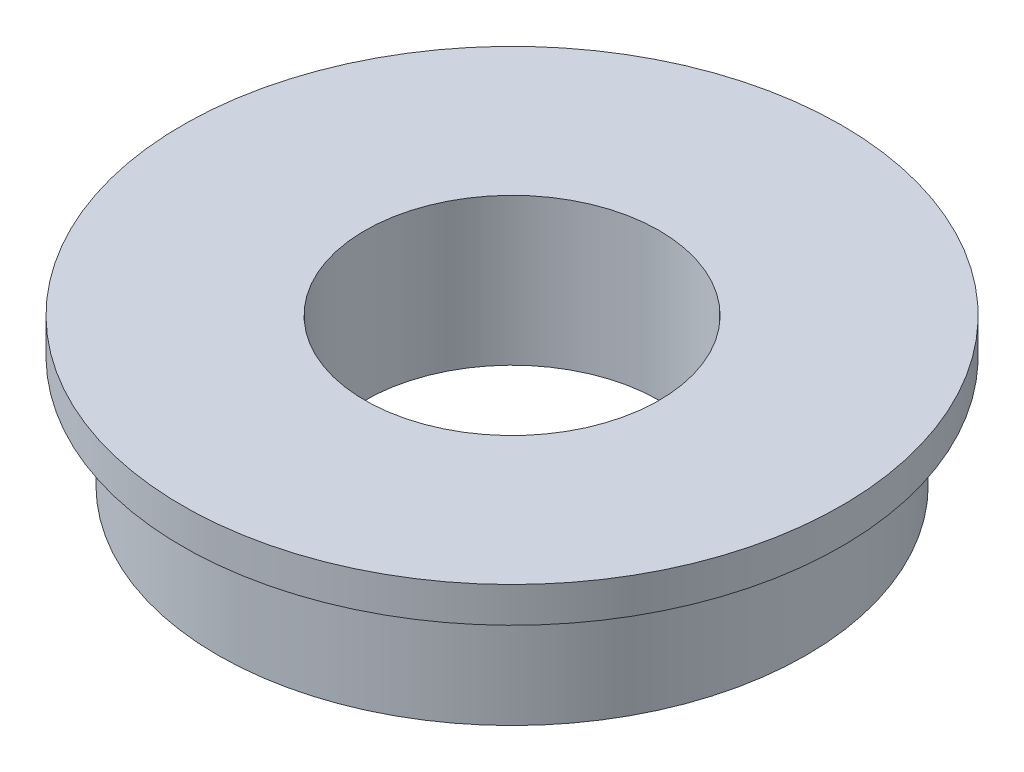
ISO-10303-21;
HEADER;
FILE_DESCRIPTION(('STEP AP214'),'2;1');
FILE_NAME('part.step','',(''),(''),'','','');
FILE_SCHEMA(('AUTOMOTIVE_DESIGN { 1 0 10303 214 1 1 1 1 }'));
ENDSEC;
DATA;
#1=APPLICATION_CONTEXT('core data for automotive mechanical design processes');
#2=APPLICATION_PROTOCOL_DEFINITION('international standard','automotive_design',2000,#1);
#3=PRODUCT_CONTEXT('',#1,'mechanical');
#4=PRODUCT('Part','Part','',(#3));
#5=PRODUCT_RELATED_PRODUCT_CATEGORY('part','',(#4));
#6=PRODUCT_DEFINITION_FORMATION('','',#4);
#7=PRODUCT_DEFINITION_CONTEXT('part definition',#1,'design');
#8=PRODUCT_DEFINITION('design','',#6,#7);
#9=PRODUCT_DEFINITION_SHAPE('','',#8);
#10=(LENGTH_UNIT() NAMED_UNIT(*) SI_UNIT(.MILLI.,.METRE.));
#11=(NAMED_UNIT(*) PLANE_ANGLE_UNIT() SI_UNIT($,.RADIAN.));
#12=(NAMED_UNIT(*) SI_UNIT($,.STERADIAN.) SOLID_ANGLE_UNIT());
#13=UNCERTAINTY_MEASURE_WITH_UNIT(LENGTH_MEASURE(1.E-05),#10,'distance_accuracy_value','');
#14=(GEOMETRIC_REPRESENTATION_CONTEXT(3) GLOBAL_UNCERTAINTY_ASSIGNED_CONTEXT((#13)) GLOBAL_UNIT_ASSIGNED_CONTEXT((#10,
#11,#12)) REPRESENTATION_CONTEXT('',''));
#15=CARTESIAN_POINT('',(0.,0.,0.));
#16=DIRECTION('',(0.,0.,1.));
#17=DIRECTION('',(1.,0.,0.));
#18=AXIS2_PLACEMENT_3D('',#15,#16,#17);
#19=CARTESIAN_POINT('',(0.,-0.15875,0.));
#20=DIRECTION('',(0.,-1.,0.));
#21=DIRECTION('',(0.,0.,-1.));
#22=AXIS2_PLACEMENT_3D('',#19,#20,#21);
#23=CYLINDRICAL_SURFACE('',#22,3.175);
#24=CARTESIAN_POINT('',(0.,3.175,0.));
#25=DIRECTION('',(0.,-1.,0.));
#26=DIRECTION('',(0.,0.,-1.));
#27=AXIS2_PLACEMENT_3D('',#24,#25,#26);
#28=CIRCLE('',#27,3.175);
#29=CARTESIAN_POINT('',(0.,3.175,-3.175));
#30=VERTEX_POINT('',#29);
#31=EDGE_CURVE('E68',#30,#30,#28,.T.);
#32=ORIENTED_EDGE('',*,*,#31,.F.);
#33=EDGE_LOOP('',(#32));
#34=FACE_BOUND('',#33,.T.);
#35=CARTESIAN_POINT('',(0.,0.,0.));
#36=DIRECTION('',(0.,-1.,0.));
#37=DIRECTION('',(0.,0.,-1.));
#38=AXIS2_PLACEMENT_3D('',#35,#36,#37);
#39=CIRCLE('',#38,3.175);
#40=CARTESIAN_POINT('',(0.,0.,-3.175));
#41=VERTEX_POINT('',#40);
#42=EDGE_CURVE('E10',#41,#41,#39,.T.);
#43=ORIENTED_EDGE('',*,*,#42,.T.);
#44=EDGE_LOOP('',(#43));
#45=FACE_BOUND('',#44,.T.);
#46=ADVANCED_FACE('F41',(#34,#45),#23,.F.);
#47=CARTESIAN_POINT('',(-3.175,0.,0.));
#48=DIRECTION('',(0.,1.,0.));
#49=DIRECTION('',(0.,0.,1.));
#50=AXIS2_PLACEMENT_3D('',#47,#48,#49);
#51=PLANE('',#50);
#52=ORIENTED_EDGE('',*,*,#42,.F.);
#53=EDGE_LOOP('',(#52));
#54=FACE_BOUND('',#53,.T.);
#55=CARTESIAN_POINT('',(0.,0.,0.));
#56=DIRECTION('',(0.,-1.,0.));
#57=DIRECTION('',(0.,0.,-1.));
#58=AXIS2_PLACEMENT_3D('',#55,#56,#57);
#59=CIRCLE('',#58,6.35);
#60=CARTESIAN_POINT('',(0.,0.,-6.35));
#61=VERTEX_POINT('',#60);
#62=EDGE_CURVE('E48',#61,#61,#59,.T.);
#63=ORIENTED_EDGE('',*,*,#62,.T.);
#64=EDGE_LOOP('',(#63));
#65=FACE_BOUND('',#64,.T.);
#66=ADVANCED_FACE('F76',(#54,#65),#51,.F.);
#67=CARTESIAN_POINT('',(0.,-0.15875,0.));
#68=DIRECTION('',(0.,-1.,0.));
#69=DIRECTION('',(0.,0.,-1.));
#70=AXIS2_PLACEMENT_3D('',#67,#68,#69);
#71=CYLINDRICAL_SURFACE('',#70,6.35);
#72=ORIENTED_EDGE('',*,*,#62,.F.);
#73=EDGE_LOOP('',(#72));
#74=FACE_BOUND('',#73,.T.);
#75=CARTESIAN_POINT('',(0.,2.413,0.));
#76=DIRECTION('',(0.,-1.,0.));
#77=DIRECTION('',(0.,0.,-1.));
#78=AXIS2_PLACEMENT_3D('',#75,#76,#77);
#79=CIRCLE('',#78,6.35);
#80=CARTESIAN_POINT('',(0.,2.413,-6.35));
#81=VERTEX_POINT('',#80);
#82=EDGE_CURVE('E53',#81,#81,#79,.T.);
#83=ORIENTED_EDGE('',*,*,#82,.T.);
#84=EDGE_LOOP('',(#83));
#85=FACE_BOUND('',#84,.T.);
#86=ADVANCED_FACE('F80',(#74,#85),#71,.T.);
#87=CARTESIAN_POINT('',(-6.35,2.413,0.));
#88=DIRECTION('',(0.,1.,0.));
#89=DIRECTION('',(0.,0.,1.));
#90=AXIS2_PLACEMENT_3D('',#87,#88,#89);
#91=PLANE('',#90);
#92=ORIENTED_EDGE('',*,*,#82,.F.);
#93=EDGE_LOOP('',(#92));
#94=FACE_BOUND('',#93,.T.);
#95=CARTESIAN_POINT('',(0.,2.413,0.));
#96=DIRECTION('',(0.,-1.,0.));
#97=DIRECTION('',(0.,0.,-1.));
#98=AXIS2_PLACEMENT_3D('',#95,#96,#97);
#99=CIRCLE('',#98,7.112);
#100=CARTESIAN_POINT('',(0.,2.413,-7.112));
#101=VERTEX_POINT('',#100);
#102=EDGE_CURVE('E58',#101,#101,#99,.T.);
#103=ORIENTED_EDGE('',*,*,#102,.T.);
#104=EDGE_LOOP('',(#103));
#105=FACE_BOUND('',#104,.T.);
#106=ADVANCED_FACE('F85',(#94,#105),#91,.F.);
#107=CARTESIAN_POINT('',(0.,-0.15875,0.));
#108=DIRECTION('',(0.,-1.,0.));
#109=DIRECTION('',(0.,0.,-1.));
#110=AXIS2_PLACEMENT_3D('',#107,#108,#109);
#111=CYLINDRICAL_SURFACE('',#110,7.112);
#112=ORIENTED_EDGE('',*,*,#102,.F.);
#113=EDGE_LOOP('',(#112));
#114=FACE_BOUND('',#113,.T.);
#115=CARTESIAN_POINT('',(0.,3.175,0.));
#116=DIRECTION('',(0.,-1.,0.));
#117=DIRECTION('',(0.,0.,-1.));
#118=AXIS2_PLACEMENT_3D('',#115,#116,#117);
#119=CIRCLE('',#118,7.112);
#120=CARTESIAN_POINT('',(0.,3.175,-7.112));
#121=VERTEX_POINT('',#120);
#122=EDGE_CURVE('E64',#121,#121,#119,.T.);
#123=ORIENTED_EDGE('',*,*,#122,.T.);
#124=EDGE_LOOP('',(#123));
#125=FACE_BOUND('',#124,.T.);
#126=ADVANCED_FACE('F91',(#114,#125),#111,.T.);
#127=CARTESIAN_POINT('',(-7.112,3.175,0.));
#128=DIRECTION('',(0.,-1.,0.));
#129=DIRECTION('',(0.,0.,-1.));
#130=AXIS2_PLACEMENT_3D('',#127,#128,#129);
#131=PLANE('',#130);
#132=ORIENTED_EDGE('',*,*,#122,.F.);
#133=EDGE_LOOP('',(#132));
#134=FACE_BOUND('',#133,.T.);
#135=ORIENTED_EDGE('',*,*,#31,.T.);
#136=EDGE_LOOP('',(#135));
#137=FACE_BOUND('',#136,.T.);
#138=ADVANCED_FACE('F73',(#134,#137),#131,.F.);
#139=CLOSED_SHELL('',(#46,#66,#86,#106,#126,#138));
#140=MANIFOLD_SOLID_BREP('B2',#139);
#141=ADVANCED_BREP_SHAPE_REPRESENTATION('',(#18,#140),#14);
#142=SHAPE_DEFINITION_REPRESENTATION(#9,#141);
ENDSEC;
END-ISO-10303-21;
